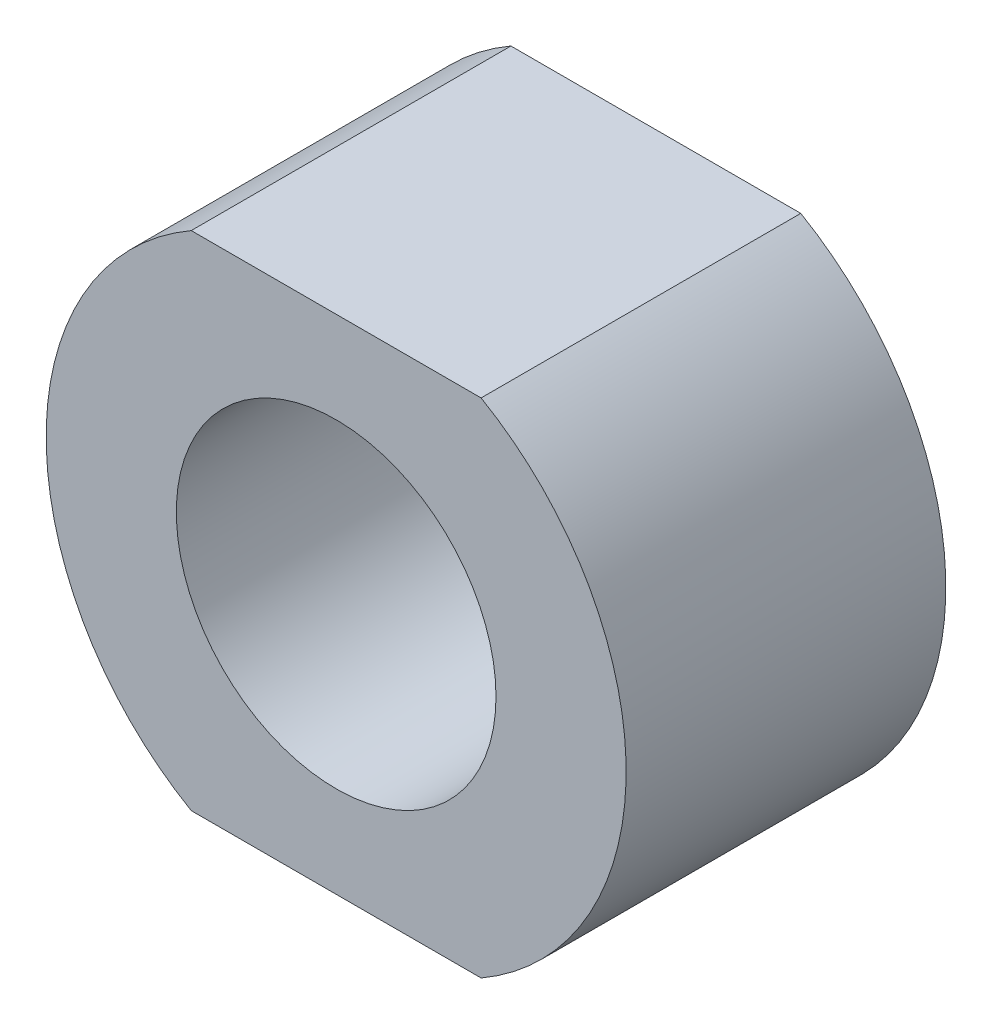
ISO-10303-21;
HEADER;
FILE_DESCRIPTION(('STEP AP214'),'2;1');
FILE_NAME('part.step','',(''),(''),'','','');
FILE_SCHEMA(('AUTOMOTIVE_DESIGN { 1 0 10303 214 1 1 1 1 }'));
ENDSEC;
DATA;
#1=APPLICATION_CONTEXT('core data for automotive mechanical design processes');
#2=APPLICATION_PROTOCOL_DEFINITION('international standard','automotive_design',2000,#1);
#3=PRODUCT_CONTEXT('',#1,'mechanical');
#4=PRODUCT('Part','Part','',(#3));
#5=PRODUCT_RELATED_PRODUCT_CATEGORY('part','',(#4));
#6=PRODUCT_DEFINITION_FORMATION('','',#4);
#7=PRODUCT_DEFINITION_CONTEXT('part definition',#1,'design');
#8=PRODUCT_DEFINITION('design','',#6,#7);
#9=PRODUCT_DEFINITION_SHAPE('','',#8);
#10=(LENGTH_UNIT() NAMED_UNIT(*) SI_UNIT(.MILLI.,.METRE.));
#11=(NAMED_UNIT(*) PLANE_ANGLE_UNIT() SI_UNIT($,.RADIAN.));
#12=(NAMED_UNIT(*) SI_UNIT($,.STERADIAN.) SOLID_ANGLE_UNIT());
#13=UNCERTAINTY_MEASURE_WITH_UNIT(LENGTH_MEASURE(1.E-05),#10,'distance_accuracy_value','');
#14=(GEOMETRIC_REPRESENTATION_CONTEXT(3) GLOBAL_UNCERTAINTY_ASSIGNED_CONTEXT((#13)) GLOBAL_UNIT_ASSIGNED_CONTEXT((#10,
#11,#12)) REPRESENTATION_CONTEXT('',''));
#15=CARTESIAN_POINT('',(0.,0.,0.));
#16=DIRECTION('',(0.,0.,1.));
#17=DIRECTION('',(1.,0.,0.));
#18=AXIS2_PLACEMENT_3D('',#15,#16,#17);
#19=CARTESIAN_POINT('',(0.,0.,7.));
#20=DIRECTION('',(0.,0.,-1.));
#21=DIRECTION('',(-1.,0.,0.));
#22=AXIS2_PLACEMENT_3D('',#19,#20,#21);
#23=CYLINDRICAL_SURFACE('',#22,6.35);
#24=CARTESIAN_POINT('',(0.,0.,7.));
#25=DIRECTION('',(0.,0.,1.));
#26=DIRECTION('',(1.,0.,0.));
#27=AXIS2_PLACEMENT_3D('',#24,#25,#26);
#28=CIRCLE('',#27,6.35);
#29=CARTESIAN_POINT('',(-3.17372021451167,5.5,7.));
#30=VERTEX_POINT('',#29);
#31=CARTESIAN_POINT('',(-3.17372021451167,-5.5,7.));
#32=VERTEX_POINT('',#31);
#33=EDGE_CURVE('E88',#30,#32,#28,.T.);
#34=ORIENTED_EDGE('',*,*,#33,.F.);
#35=DIRECTION('',(0.,0.,-1.));
#36=VECTOR('',#35,1.);
#37=CARTESIAN_POINT('',(-3.17372021451167,5.5,7.));
#38=LINE('',#37,#36);
#39=CARTESIAN_POINT('',(-3.17372021451167,5.5,0.));
#40=VERTEX_POINT('',#39);
#41=EDGE_CURVE('E105',#30,#40,#38,.T.);
#42=ORIENTED_EDGE('',*,*,#41,.T.);
#43=CARTESIAN_POINT('',(0.,0.,0.));
#44=DIRECTION('',(0.,0.,1.));
#45=DIRECTION('',(1.,0.,0.));
#46=AXIS2_PLACEMENT_3D('',#43,#44,#45);
#47=CIRCLE('',#46,6.35);
#48=CARTESIAN_POINT('',(-3.17372021451167,-5.5,0.));
#49=VERTEX_POINT('',#48);
#50=EDGE_CURVE('E91',#40,#49,#47,.T.);
#51=ORIENTED_EDGE('',*,*,#50,.T.);
#52=DIRECTION('',(0.,0.,-1.));
#53=VECTOR('',#52,1.);
#54=CARTESIAN_POINT('',(-3.17372021451167,-5.5,7.));
#55=LINE('',#54,#53);
#56=EDGE_CURVE('E48',#49,#32,#55,.F.);
#57=ORIENTED_EDGE('',*,*,#56,.T.);
#58=EDGE_LOOP('',(#34,#42,#51,#57));
#59=FACE_BOUND('',#58,.T.);
#60=ADVANCED_FACE('F33',(#59),#23,.T.);
#61=CARTESIAN_POINT('',(3.17372021451167,-5.5,0.));
#62=VERTEX_POINT('',#61);
#63=CARTESIAN_POINT('',(3.17372021451167,5.5,0.));
#64=VERTEX_POINT('',#63);
#65=EDGE_CURVE('E94',#62,#64,#47,.T.);
#66=ORIENTED_EDGE('',*,*,#65,.T.);
#67=DIRECTION('',(0.,0.,-1.));
#68=VECTOR('',#67,1.);
#69=CARTESIAN_POINT('',(3.17372021451167,5.5,7.));
#70=LINE('',#69,#68);
#71=CARTESIAN_POINT('',(3.17372021451167,5.5,7.));
#72=VERTEX_POINT('',#71);
#73=EDGE_CURVE('E56',#64,#72,#70,.F.);
#74=ORIENTED_EDGE('',*,*,#73,.T.);
#75=CARTESIAN_POINT('',(3.17372021451167,-5.5,7.));
#76=VERTEX_POINT('',#75);
#77=EDGE_CURVE('E86',#76,#72,#28,.T.);
#78=ORIENTED_EDGE('',*,*,#77,.F.);
#79=DIRECTION('',(0.,0.,-1.));
#80=VECTOR('',#79,1.);
#81=CARTESIAN_POINT('',(3.17372021451167,-5.5,7.));
#82=LINE('',#81,#80);
#83=EDGE_CURVE('E71',#76,#62,#82,.T.);
#84=ORIENTED_EDGE('',*,*,#83,.T.);
#85=EDGE_LOOP('',(#66,#74,#78,#84));
#86=FACE_BOUND('',#85,.T.);
#87=ADVANCED_FACE('F35',(#86),#23,.T.);
#88=CARTESIAN_POINT('',(0.,0.,7.));
#89=DIRECTION('',(0.,0.,1.));
#90=DIRECTION('',(1.,0.,0.));
#91=AXIS2_PLACEMENT_3D('',#88,#89,#90);
#92=PLANE('',#91);
#93=DIRECTION('',(1.,0.,0.));
#94=VECTOR('',#93,1.);
#95=CARTESIAN_POINT('',(-5.02020442120276,5.5,7.));
#96=LINE('',#95,#94);
#97=EDGE_CURVE('E89',#30,#72,#96,.T.);
#98=ORIENTED_EDGE('',*,*,#97,.F.);
#99=ORIENTED_EDGE('',*,*,#33,.T.);
#100=DIRECTION('',(-1.,0.,0.));
#101=VECTOR('',#100,1.);
#102=CARTESIAN_POINT('',(-5.02020442120276,-5.5,7.));
#103=LINE('',#102,#101);
#104=EDGE_CURVE('E74',#76,#32,#103,.T.);
#105=ORIENTED_EDGE('',*,*,#104,.F.);
#106=ORIENTED_EDGE('',*,*,#77,.T.);
#107=EDGE_LOOP('',(#98,#99,#105,#106));
#108=FACE_BOUND('',#107,.T.);
#109=CARTESIAN_POINT('',(0.,0.,7.));
#110=DIRECTION('',(0.,0.,1.));
#111=DIRECTION('',(1.,0.,0.));
#112=AXIS2_PLACEMENT_3D('',#109,#110,#111);
#113=CIRCLE('',#112,3.5);
#114=CARTESIAN_POINT('',(3.5,0.,7.));
#115=VERTEX_POINT('',#114);
#116=EDGE_CURVE('E97',#115,#115,#113,.T.);
#117=ORIENTED_EDGE('',*,*,#116,.F.);
#118=EDGE_LOOP('',(#117));
#119=FACE_BOUND('',#118,.T.);
#120=ADVANCED_FACE('F84',(#108,#119),#92,.T.);
#121=CARTESIAN_POINT('',(0.,0.,0.));
#122=DIRECTION('',(0.,0.,1.));
#123=DIRECTION('',(1.,0.,0.));
#124=AXIS2_PLACEMENT_3D('',#121,#122,#123);
#125=PLANE('',#124);
#126=CARTESIAN_POINT('',(0.,0.,0.));
#127=DIRECTION('',(0.,0.,1.));
#128=DIRECTION('',(1.,0.,0.));
#129=AXIS2_PLACEMENT_3D('',#126,#127,#128);
#130=CIRCLE('',#129,3.5);
#131=CARTESIAN_POINT('',(3.5,0.,0.));
#132=VERTEX_POINT('',#131);
#133=EDGE_CURVE('E99',#132,#132,#130,.T.);
#134=ORIENTED_EDGE('',*,*,#133,.T.);
#135=EDGE_LOOP('',(#134));
#136=FACE_BOUND('',#135,.T.);
#137=ORIENTED_EDGE('',*,*,#50,.F.);
#138=DIRECTION('',(1.,0.,0.));
#139=VECTOR('',#138,1.);
#140=CARTESIAN_POINT('',(0.,5.5,0.));
#141=LINE('',#140,#139);
#142=EDGE_CURVE('E11',#40,#64,#141,.T.);
#143=ORIENTED_EDGE('',*,*,#142,.T.);
#144=ORIENTED_EDGE('',*,*,#65,.F.);
#145=DIRECTION('',(-1.,0.,0.));
#146=VECTOR('',#145,1.);
#147=CARTESIAN_POINT('',(0.,-5.5,0.));
#148=LINE('',#147,#146);
#149=EDGE_CURVE('E41',#62,#49,#148,.T.);
#150=ORIENTED_EDGE('',*,*,#149,.T.);
#151=EDGE_LOOP('',(#137,#143,#144,#150));
#152=FACE_BOUND('',#151,.T.);
#153=ADVANCED_FACE('F102',(#136,#152),#125,.F.);
#154=CARTESIAN_POINT('',(0.,0.,0.));
#155=DIRECTION('',(0.,0.,1.));
#156=DIRECTION('',(1.,0.,0.));
#157=AXIS2_PLACEMENT_3D('',#154,#155,#156);
#158=CYLINDRICAL_SURFACE('',#157,3.5);
#159=ORIENTED_EDGE('',*,*,#133,.F.);
#160=EDGE_LOOP('',(#159));
#161=FACE_BOUND('',#160,.T.);
#162=ORIENTED_EDGE('',*,*,#116,.T.);
#163=EDGE_LOOP('',(#162));
#164=FACE_BOUND('',#163,.T.);
#165=ADVANCED_FACE('F113',(#161,#164),#158,.F.);
#166=CARTESIAN_POINT('',(-5.02020442120276,-5.5,0.));
#167=DIRECTION('',(0.,1.,0.));
#168=DIRECTION('',(0.,0.,1.));
#169=AXIS2_PLACEMENT_3D('',#166,#167,#168);
#170=PLANE('',#169);
#171=ORIENTED_EDGE('',*,*,#104,.T.);
#172=ORIENTED_EDGE('',*,*,#56,.F.);
#173=ORIENTED_EDGE('',*,*,#149,.F.);
#174=ORIENTED_EDGE('',*,*,#83,.F.);
#175=EDGE_LOOP('',(#171,#172,#173,#174));
#176=FACE_BOUND('',#175,.T.);
#177=ADVANCED_FACE('F73',(#176),#170,.F.);
#178=CARTESIAN_POINT('',(-5.02020442120276,5.5,0.));
#179=DIRECTION('',(0.,-1.,0.));
#180=DIRECTION('',(0.,0.,-1.));
#181=AXIS2_PLACEMENT_3D('',#178,#179,#180);
#182=PLANE('',#181);
#183=ORIENTED_EDGE('',*,*,#97,.T.);
#184=ORIENTED_EDGE('',*,*,#73,.F.);
#185=ORIENTED_EDGE('',*,*,#142,.F.);
#186=ORIENTED_EDGE('',*,*,#41,.F.);
#187=EDGE_LOOP('',(#183,#184,#185,#186));
#188=FACE_BOUND('',#187,.T.);
#189=ADVANCED_FACE('F152',(#188),#182,.F.);
#190=CLOSED_SHELL('',(#60,#87,#120,#153,#165,#177,#189));
#191=MANIFOLD_SOLID_BREP('B2',#190);
#192=ADVANCED_BREP_SHAPE_REPRESENTATION('',(#18,#191),#14);
#193=SHAPE_DEFINITION_REPRESENTATION(#9,#192);
ENDSEC;
END-ISO-10303-21;
